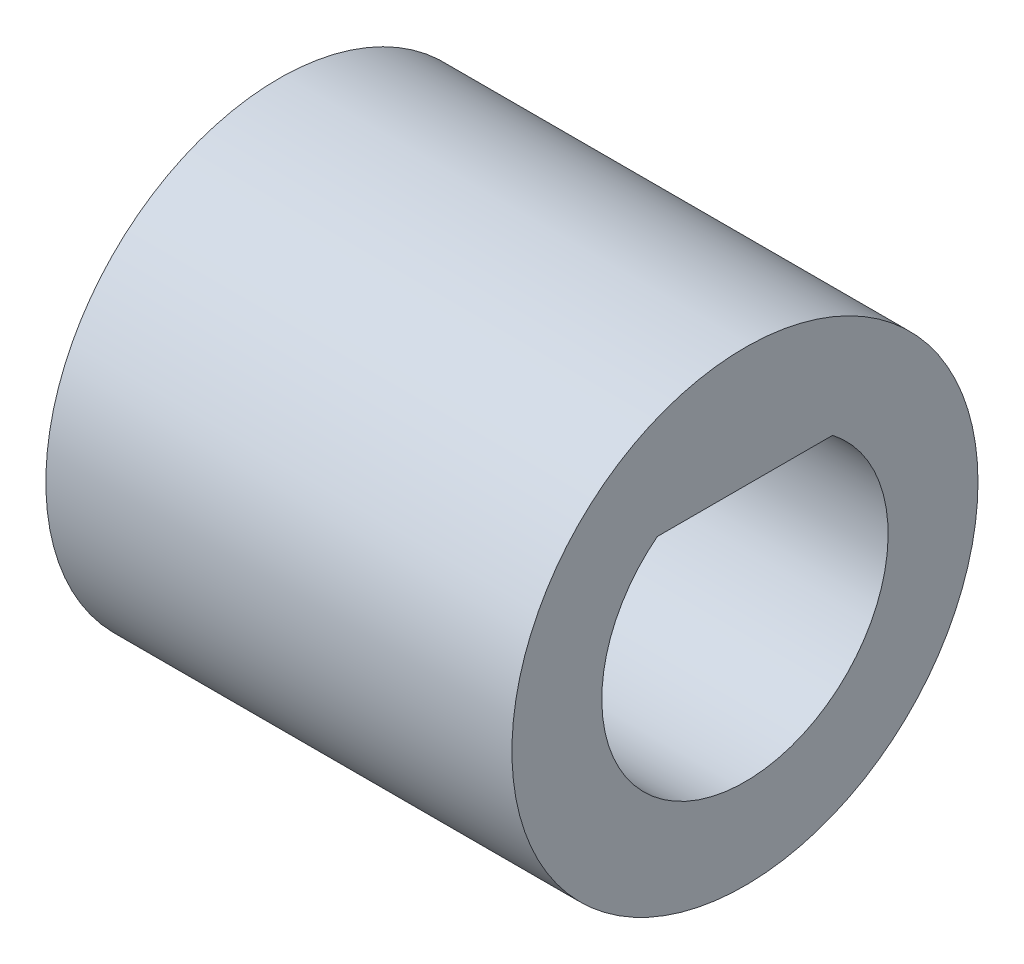
ISO-10303-21;
HEADER;
FILE_DESCRIPTION(('STEP AP214'),'2;1');
FILE_NAME('part.step','',(''),(''),'','','');
FILE_SCHEMA(('AUTOMOTIVE_DESIGN { 1 0 10303 214 1 1 1 1 }'));
ENDSEC;
DATA;
#1=APPLICATION_CONTEXT('core data for automotive mechanical design processes');
#2=APPLICATION_PROTOCOL_DEFINITION('international standard','automotive_design',2000,#1);
#3=PRODUCT_CONTEXT('',#1,'mechanical');
#4=PRODUCT('Part','Part','',(#3));
#5=PRODUCT_RELATED_PRODUCT_CATEGORY('part','',(#4));
#6=PRODUCT_DEFINITION_FORMATION('','',#4);
#7=PRODUCT_DEFINITION_CONTEXT('part definition',#1,'design');
#8=PRODUCT_DEFINITION('design','',#6,#7);
#9=PRODUCT_DEFINITION_SHAPE('','',#8);
#10=(LENGTH_UNIT() NAMED_UNIT(*) SI_UNIT(.MILLI.,.METRE.));
#11=(NAMED_UNIT(*) PLANE_ANGLE_UNIT() SI_UNIT($,.RADIAN.));
#12=(NAMED_UNIT(*) SI_UNIT($,.STERADIAN.) SOLID_ANGLE_UNIT());
#13=UNCERTAINTY_MEASURE_WITH_UNIT(LENGTH_MEASURE(1.E-05),#10,'distance_accuracy_value','');
#14=(GEOMETRIC_REPRESENTATION_CONTEXT(3) GLOBAL_UNCERTAINTY_ASSIGNED_CONTEXT((#13)) GLOBAL_UNIT_ASSIGNED_CONTEXT((#10,
#11,#12)) REPRESENTATION_CONTEXT('',''));
#15=CARTESIAN_POINT('',(0.,0.,0.));
#16=DIRECTION('',(0.,0.,1.));
#17=DIRECTION('',(1.,0.,0.));
#18=AXIS2_PLACEMENT_3D('',#15,#16,#17);
#19=CARTESIAN_POINT('',(7.,0.,0.));
#20=DIRECTION('',(-1.,0.,0.));
#21=DIRECTION('',(0.,0.,1.));
#22=AXIS2_PLACEMENT_3D('',#19,#20,#21);
#23=CYLINDRICAL_SURFACE('',#22,3.5);
#24=CARTESIAN_POINT('',(7.,0.,0.));
#25=DIRECTION('',(1.,0.,0.));
#26=DIRECTION('',(0.,0.,-1.));
#27=AXIS2_PLACEMENT_3D('',#24,#25,#26);
#28=CIRCLE('',#27,3.5);
#29=CARTESIAN_POINT('',(7.,0.,-3.5));
#30=VERTEX_POINT('',#29);
#31=EDGE_CURVE('E11',#30,#30,#28,.T.);
#32=ORIENTED_EDGE('',*,*,#31,.F.);
#33=EDGE_LOOP('',(#32));
#34=FACE_BOUND('',#33,.T.);
#35=CARTESIAN_POINT('',(0.,0.,0.));
#36=DIRECTION('',(1.,0.,0.));
#37=DIRECTION('',(0.,0.,-1.));
#38=AXIS2_PLACEMENT_3D('',#35,#36,#37);
#39=CIRCLE('',#38,3.5);
#40=CARTESIAN_POINT('',(0.,0.,-3.5));
#41=VERTEX_POINT('',#40);
#42=EDGE_CURVE('E38',#41,#41,#39,.T.);
#43=ORIENTED_EDGE('',*,*,#42,.T.);
#44=EDGE_LOOP('',(#43));
#45=FACE_BOUND('',#44,.T.);
#46=ADVANCED_FACE('F35',(#34,#45),#23,.T.);
#47=CARTESIAN_POINT('',(7.,0.,0.));
#48=DIRECTION('',(1.,0.,0.));
#49=DIRECTION('',(0.,0.,-1.));
#50=AXIS2_PLACEMENT_3D('',#47,#48,#49);
#51=PLANE('',#50);
#52=CARTESIAN_POINT('',(7.,0.,0.));
#53=DIRECTION('',(1.,0.,0.));
#54=DIRECTION('',(0.,0.,-1.));
#55=AXIS2_PLACEMENT_3D('',#52,#53,#54);
#56=CIRCLE('',#55,2.15);
#57=CARTESIAN_POINT('',(7.,1.7,1.31624465810882));
#58=VERTEX_POINT('',#57);
#59=CARTESIAN_POINT('',(7.,1.7,-1.31624465810882));
#60=VERTEX_POINT('',#59);
#61=EDGE_CURVE('E49',#58,#60,#56,.T.);
#62=ORIENTED_EDGE('',*,*,#61,.F.);
#63=DIRECTION('',(0.,0.,1.));
#64=VECTOR('',#63,1.);
#65=CARTESIAN_POINT('',(7.,1.7,1.31624465810882));
#66=LINE('',#65,#64);
#67=EDGE_CURVE('E68',#60,#58,#66,.T.);
#68=ORIENTED_EDGE('',*,*,#67,.F.);
#69=EDGE_LOOP('',(#62,#68));
#70=FACE_BOUND('',#69,.T.);
#71=ORIENTED_EDGE('',*,*,#31,.T.);
#72=EDGE_LOOP('',(#71));
#73=FACE_BOUND('',#72,.T.);
#74=ADVANCED_FACE('F72',(#70,#73),#51,.T.);
#75=CARTESIAN_POINT('',(0.,0.,0.));
#76=DIRECTION('',(1.,0.,0.));
#77=DIRECTION('',(0.,0.,-1.));
#78=AXIS2_PLACEMENT_3D('',#75,#76,#77);
#79=PLANE('',#78);
#80=ORIENTED_EDGE('',*,*,#42,.F.);
#81=EDGE_LOOP('',(#80));
#82=FACE_BOUND('',#81,.T.);
#83=ADVANCED_FACE('F92',(#82),#79,.F.);
#84=CARTESIAN_POINT('',(2.,0.,0.));
#85=DIRECTION('',(1.,0.,0.));
#86=DIRECTION('',(0.,0.,-1.));
#87=AXIS2_PLACEMENT_3D('',#84,#85,#86);
#88=CYLINDRICAL_SURFACE('',#87,2.15);
#89=ORIENTED_EDGE('',*,*,#61,.T.);
#90=DIRECTION('',(1.,0.,0.));
#91=VECTOR('',#90,1.);
#92=CARTESIAN_POINT('',(2.,1.7,-1.31624465810882));
#93=LINE('',#92,#91);
#94=CARTESIAN_POINT('',(2.,1.7,-1.31624465810882));
#95=VERTEX_POINT('',#94);
#96=EDGE_CURVE('E65',#95,#60,#93,.T.);
#97=ORIENTED_EDGE('',*,*,#96,.F.);
#98=CARTESIAN_POINT('',(2.,0.,0.));
#99=DIRECTION('',(1.,0.,0.));
#100=DIRECTION('',(0.,0.,-1.));
#101=AXIS2_PLACEMENT_3D('',#98,#99,#100);
#102=CIRCLE('',#101,2.15);
#103=CARTESIAN_POINT('',(2.,1.7,1.31624465810882));
#104=VERTEX_POINT('',#103);
#105=EDGE_CURVE('E63',#104,#95,#102,.T.);
#106=ORIENTED_EDGE('',*,*,#105,.F.);
#107=DIRECTION('',(1.,0.,0.));
#108=VECTOR('',#107,1.);
#109=CARTESIAN_POINT('',(2.,1.7,1.31624465810882));
#110=LINE('',#109,#108);
#111=EDGE_CURVE('E57',#104,#58,#110,.T.);
#112=ORIENTED_EDGE('',*,*,#111,.T.);
#113=EDGE_LOOP('',(#89,#97,#106,#112));
#114=FACE_BOUND('',#113,.T.);
#115=ADVANCED_FACE('F61',(#114),#88,.F.);
#116=CARTESIAN_POINT('',(2.,1.7,1.31624465810882));
#117=DIRECTION('',(0.,1.,0.));
#118=DIRECTION('',(0.,0.,1.));
#119=AXIS2_PLACEMENT_3D('',#116,#117,#118);
#120=PLANE('',#119);
#121=ORIENTED_EDGE('',*,*,#67,.T.);
#122=ORIENTED_EDGE('',*,*,#111,.F.);
#123=DIRECTION('',(0.,0.,1.));
#124=VECTOR('',#123,1.);
#125=CARTESIAN_POINT('',(2.,1.7,1.31624465810882));
#126=LINE('',#125,#124);
#127=EDGE_CURVE('E76',#95,#104,#126,.T.);
#128=ORIENTED_EDGE('',*,*,#127,.F.);
#129=ORIENTED_EDGE('',*,*,#96,.T.);
#130=EDGE_LOOP('',(#121,#122,#128,#129));
#131=FACE_BOUND('',#130,.T.);
#132=ADVANCED_FACE('F69',(#131),#120,.F.);
#133=CARTESIAN_POINT('',(2.,0.,0.));
#134=DIRECTION('',(1.,0.,0.));
#135=DIRECTION('',(0.,0.,-1.));
#136=AXIS2_PLACEMENT_3D('',#133,#134,#135);
#137=PLANE('',#136);
#138=ORIENTED_EDGE('',*,*,#105,.T.);
#139=ORIENTED_EDGE('',*,*,#127,.T.);
#140=EDGE_LOOP('',(#138,#139));
#141=FACE_BOUND('',#140,.T.);
#142=ADVANCED_FACE('F80',(#141),#137,.T.);
#143=CLOSED_SHELL('',(#46,#74,#83,#115,#132,#142));
#144=MANIFOLD_SOLID_BREP('B2',#143);
#145=ADVANCED_BREP_SHAPE_REPRESENTATION('',(#18,#144),#14);
#146=SHAPE_DEFINITION_REPRESENTATION(#9,#145);
ENDSEC;
END-ISO-10303-21;
